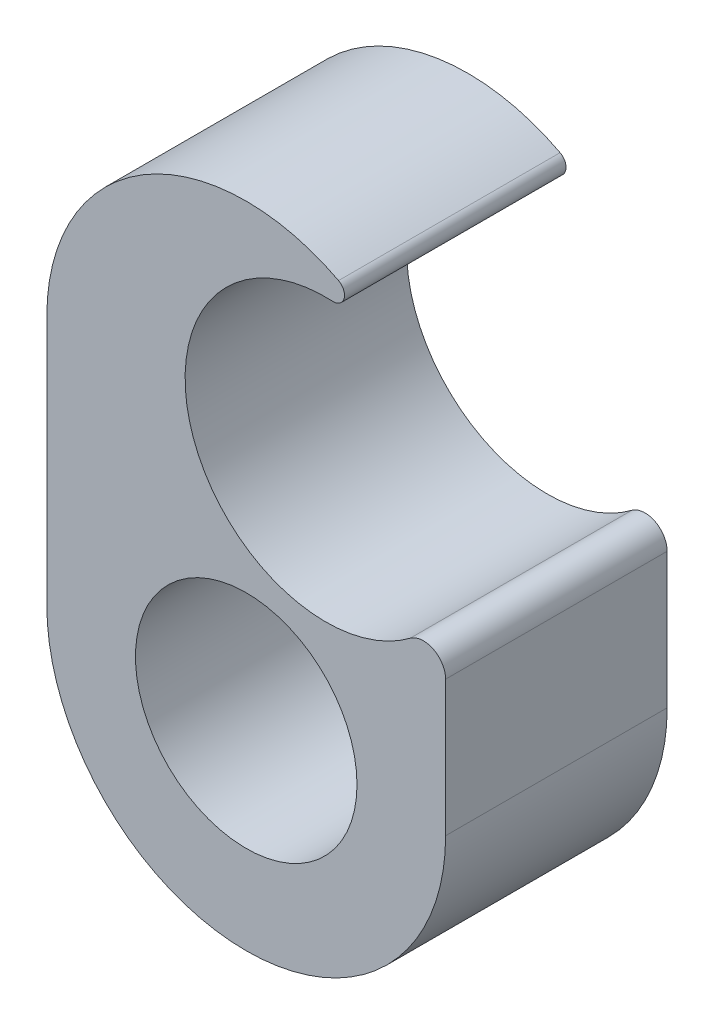
ISO-10303-21;
HEADER;
FILE_DESCRIPTION(('STEP AP214'),'2;1');
FILE_NAME('part.step','',(''),(''),'','','');
FILE_SCHEMA(('AUTOMOTIVE_DESIGN { 1 0 10303 214 1 1 1 1 }'));
ENDSEC;
DATA;
#1=APPLICATION_CONTEXT('core data for automotive mechanical design processes');
#2=APPLICATION_PROTOCOL_DEFINITION('international standard','automotive_design',2000,#1);
#3=PRODUCT_CONTEXT('',#1,'mechanical');
#4=PRODUCT('Part','Part','',(#3));
#5=PRODUCT_RELATED_PRODUCT_CATEGORY('part','',(#4));
#6=PRODUCT_DEFINITION_FORMATION('','',#4);
#7=PRODUCT_DEFINITION_CONTEXT('part definition',#1,'design');
#8=PRODUCT_DEFINITION('design','',#6,#7);
#9=PRODUCT_DEFINITION_SHAPE('','',#8);
#10=(LENGTH_UNIT() NAMED_UNIT(*) SI_UNIT(.MILLI.,.METRE.));
#11=(NAMED_UNIT(*) PLANE_ANGLE_UNIT() SI_UNIT($,.RADIAN.));
#12=(NAMED_UNIT(*) SI_UNIT($,.STERADIAN.) SOLID_ANGLE_UNIT());
#13=UNCERTAINTY_MEASURE_WITH_UNIT(LENGTH_MEASURE(1.E-05),#10,'distance_accuracy_value','');
#14=(GEOMETRIC_REPRESENTATION_CONTEXT(3) GLOBAL_UNCERTAINTY_ASSIGNED_CONTEXT((#13)) GLOBAL_UNIT_ASSIGNED_CONTEXT((#10,
#11,#12)) REPRESENTATION_CONTEXT('',''));
#15=CARTESIAN_POINT('',(0.,0.,0.));
#16=DIRECTION('',(0.,0.,1.));
#17=DIRECTION('',(1.,0.,0.));
#18=AXIS2_PLACEMENT_3D('',#15,#16,#17);
#19=CARTESIAN_POINT('',(9.,0.,10.));
#20=DIRECTION('',(0.,0.,-1.));
#21=DIRECTION('',(-1.,0.,0.));
#22=AXIS2_PLACEMENT_3D('',#19,#20,#21);
#23=PLANE('',#22);
#24=CARTESIAN_POINT('',(9.,0.,10.));
#25=DIRECTION('',(0.,0.,1.));
#26=DIRECTION('',(-1.,0.,0.));
#27=AXIS2_PLACEMENT_3D('',#24,#25,#26);
#28=CIRCLE('',#27,9.);
#29=CARTESIAN_POINT('',(0.,0.,10.));
#30=VERTEX_POINT('',#29);
#31=CARTESIAN_POINT('',(18.,0.,10.));
#32=VERTEX_POINT('',#31);
#33=EDGE_CURVE('E137',#30,#32,#28,.T.);
#34=ORIENTED_EDGE('',*,*,#33,.T.);
#35=DIRECTION('',(0.,1.,0.));
#36=VECTOR('',#35,1.);
#37=CARTESIAN_POINT('',(18.,0.,10.));
#38=LINE('',#37,#36);
#39=CARTESIAN_POINT('',(18.,6.11923791832924,10.));
#40=VERTEX_POINT('',#39);
#41=EDGE_CURVE('E90',#32,#40,#38,.T.);
#42=ORIENTED_EDGE('',*,*,#41,.T.);
#43=CARTESIAN_POINT('',(17.,6.11923791832924,10.));
#44=DIRECTION('',(0.,0.,1.));
#45=DIRECTION('',(1.,0.,0.));
#46=AXIS2_PLACEMENT_3D('',#43,#44,#45);
#47=CIRCLE('',#46,1.);
#48=CARTESIAN_POINT('',(16.4001382709992,6.91934160291029,10.));
#49=VERTEX_POINT('',#48);
#50=EDGE_CURVE('E149',#40,#49,#47,.T.);
#51=ORIENTED_EDGE('',*,*,#50,.T.);
#52=CARTESIAN_POINT('',(12.5910162918442,12.,10.));
#53=DIRECTION('',(0.,0.,-1.));
#54=DIRECTION('',(1.,0.,0.));
#55=AXIS2_PLACEMENT_3D('',#52,#53,#54);
#56=CIRCLE('',#55,6.35);
#57=CARTESIAN_POINT('',(12.910980025213,18.3419337121519,10.));
#58=VERTEX_POINT('',#57);
#59=EDGE_CURVE('E106',#49,#58,#56,.T.);
#60=ORIENTED_EDGE('',*,*,#59,.T.);
#61=CARTESIAN_POINT('',(12.9361740199664,18.8412985713765,10.));
#62=DIRECTION('',(0.,0.,1.));
#63=DIRECTION('',(-1.,0.,0.));
#64=AXIS2_PLACEMENT_3D('',#61,#62,#63);
#65=CIRCLE('',#64,0.499999999999999);
#66=CARTESIAN_POINT('',(13.1677136681998,19.2844569982353,10.));
#67=VERTEX_POINT('',#66);
#68=EDGE_CURVE('E100',#58,#67,#65,.T.);
#69=ORIENTED_EDGE('',*,*,#68,.T.);
#70=CARTESIAN_POINT('',(9.,11.3076053147764,10.));
#71=DIRECTION('',(0.,0.,1.));
#72=DIRECTION('',(-1.,0.,0.));
#73=AXIS2_PLACEMENT_3D('',#70,#71,#72);
#74=CIRCLE('',#73,9.);
#75=CARTESIAN_POINT('',(0.,11.3076053147764,10.));
#76=VERTEX_POINT('',#75);
#77=EDGE_CURVE('E104',#67,#76,#74,.T.);
#78=ORIENTED_EDGE('',*,*,#77,.T.);
#79=DIRECTION('',(0.,-1.,0.));
#80=VECTOR('',#79,1.);
#81=CARTESIAN_POINT('',(0.,0.,10.));
#82=LINE('',#81,#80);
#83=EDGE_CURVE('E50',#76,#30,#82,.T.);
#84=ORIENTED_EDGE('',*,*,#83,.T.);
#85=EDGE_LOOP('',(#34,#42,#51,#60,#69,#78,#84));
#86=FACE_BOUND('',#85,.T.);
#87=CARTESIAN_POINT('',(9.,0.,10.));
#88=DIRECTION('',(0.,0.,1.));
#89=DIRECTION('',(1.,0.,0.));
#90=AXIS2_PLACEMENT_3D('',#87,#88,#89);
#91=CIRCLE('',#90,5.);
#92=CARTESIAN_POINT('',(14.,0.,10.));
#93=VERTEX_POINT('',#92);
#94=EDGE_CURVE('E128',#93,#93,#91,.T.);
#95=ORIENTED_EDGE('',*,*,#94,.F.);
#96=EDGE_LOOP('',(#95));
#97=FACE_BOUND('',#96,.T.);
#98=ADVANCED_FACE('F33',(#86,#97),#23,.F.);
#99=CARTESIAN_POINT('',(9.,0.,0.));
#100=DIRECTION('',(0.,0.,-1.));
#101=DIRECTION('',(-1.,0.,0.));
#102=AXIS2_PLACEMENT_3D('',#99,#100,#101);
#103=PLANE('',#102);
#104=CARTESIAN_POINT('',(9.,0.,0.));
#105=DIRECTION('',(0.,0.,1.));
#106=DIRECTION('',(-1.,0.,0.));
#107=AXIS2_PLACEMENT_3D('',#104,#105,#106);
#108=CIRCLE('',#107,9.);
#109=CARTESIAN_POINT('',(0.,0.,0.));
#110=VERTEX_POINT('',#109);
#111=CARTESIAN_POINT('',(18.,0.,0.));
#112=VERTEX_POINT('',#111);
#113=EDGE_CURVE('E124',#110,#112,#108,.T.);
#114=ORIENTED_EDGE('',*,*,#113,.F.);
#115=DIRECTION('',(0.,-1.,0.));
#116=VECTOR('',#115,1.);
#117=CARTESIAN_POINT('',(0.,0.,0.));
#118=LINE('',#117,#116);
#119=CARTESIAN_POINT('',(0.,11.3076053147764,0.));
#120=VERTEX_POINT('',#119);
#121=EDGE_CURVE('E82',#120,#110,#118,.T.);
#122=ORIENTED_EDGE('',*,*,#121,.F.);
#123=CARTESIAN_POINT('',(9.,11.3076053147764,0.));
#124=DIRECTION('',(0.,0.,1.));
#125=DIRECTION('',(-1.,0.,0.));
#126=AXIS2_PLACEMENT_3D('',#123,#124,#125);
#127=CIRCLE('',#126,9.);
#128=CARTESIAN_POINT('',(13.1677136681998,19.2844569982353,0.));
#129=VERTEX_POINT('',#128);
#130=EDGE_CURVE('E76',#129,#120,#127,.T.);
#131=ORIENTED_EDGE('',*,*,#130,.F.);
#132=CARTESIAN_POINT('',(12.9361740199664,18.8412985713765,0.));
#133=DIRECTION('',(0.,0.,1.));
#134=DIRECTION('',(-1.,0.,0.));
#135=AXIS2_PLACEMENT_3D('',#132,#133,#134);
#136=CIRCLE('',#135,0.499999999999999);
#137=CARTESIAN_POINT('',(12.910980025213,18.3419337121519,0.));
#138=VERTEX_POINT('',#137);
#139=EDGE_CURVE('E114',#138,#129,#136,.T.);
#140=ORIENTED_EDGE('',*,*,#139,.F.);
#141=CARTESIAN_POINT('',(12.5910162918442,12.,0.));
#142=DIRECTION('',(0.,0.,-1.));
#143=DIRECTION('',(1.,0.,0.));
#144=AXIS2_PLACEMENT_3D('',#141,#142,#143);
#145=CIRCLE('',#144,6.35);
#146=CARTESIAN_POINT('',(16.4001382709992,6.91934160291029,0.));
#147=VERTEX_POINT('',#146);
#148=EDGE_CURVE('E132',#147,#138,#145,.T.);
#149=ORIENTED_EDGE('',*,*,#148,.F.);
#150=CARTESIAN_POINT('',(17.,6.11923791832924,0.));
#151=DIRECTION('',(0.,0.,1.));
#152=DIRECTION('',(1.,0.,0.));
#153=AXIS2_PLACEMENT_3D('',#150,#151,#152);
#154=CIRCLE('',#153,1.);
#155=CARTESIAN_POINT('',(18.,6.11923791832924,0.));
#156=VERTEX_POINT('',#155);
#157=EDGE_CURVE('E130',#156,#147,#154,.T.);
#158=ORIENTED_EDGE('',*,*,#157,.F.);
#159=DIRECTION('',(0.,1.,0.));
#160=VECTOR('',#159,1.);
#161=CARTESIAN_POINT('',(18.,0.,0.));
#162=LINE('',#161,#160);
#163=EDGE_CURVE('E127',#112,#156,#162,.T.);
#164=ORIENTED_EDGE('',*,*,#163,.F.);
#165=EDGE_LOOP('',(#114,#122,#131,#140,#149,#158,#164));
#166=FACE_BOUND('',#165,.T.);
#167=CARTESIAN_POINT('',(9.,0.,0.));
#168=DIRECTION('',(0.,0.,1.));
#169=DIRECTION('',(1.,0.,0.));
#170=AXIS2_PLACEMENT_3D('',#167,#168,#169);
#171=CIRCLE('',#170,5.);
#172=CARTESIAN_POINT('',(14.,0.,0.));
#173=VERTEX_POINT('',#172);
#174=EDGE_CURVE('E161',#173,#173,#171,.T.);
#175=ORIENTED_EDGE('',*,*,#174,.T.);
#176=EDGE_LOOP('',(#175));
#177=FACE_BOUND('',#176,.T.);
#178=ADVANCED_FACE('F153',(#166,#177),#103,.T.);
#179=CARTESIAN_POINT('',(9.,0.,10.));
#180=DIRECTION('',(0.,0.,-1.));
#181=DIRECTION('',(-1.,0.,0.));
#182=AXIS2_PLACEMENT_3D('',#179,#180,#181);
#183=CYLINDRICAL_SURFACE('',#182,9.);
#184=ORIENTED_EDGE('',*,*,#113,.T.);
#185=DIRECTION('',(0.,0.,-1.));
#186=VECTOR('',#185,1.);
#187=CARTESIAN_POINT('',(18.,0.,10.));
#188=LINE('',#187,#186);
#189=EDGE_CURVE('E11',#32,#112,#188,.T.);
#190=ORIENTED_EDGE('',*,*,#189,.F.);
#191=ORIENTED_EDGE('',*,*,#33,.F.);
#192=DIRECTION('',(0.,0.,-1.));
#193=VECTOR('',#192,1.);
#194=CARTESIAN_POINT('',(0.,0.,10.));
#195=LINE('',#194,#193);
#196=EDGE_CURVE('E120',#30,#110,#195,.T.);
#197=ORIENTED_EDGE('',*,*,#196,.T.);
#198=EDGE_LOOP('',(#184,#190,#191,#197));
#199=FACE_BOUND('',#198,.T.);
#200=ADVANCED_FACE('F35',(#199),#183,.T.);
#201=CARTESIAN_POINT('',(18.,0.,10.));
#202=DIRECTION('',(-1.,0.,0.));
#203=DIRECTION('',(0.,0.,1.));
#204=AXIS2_PLACEMENT_3D('',#201,#202,#203);
#205=PLANE('',#204);
#206=ORIENTED_EDGE('',*,*,#163,.T.);
#207=DIRECTION('',(0.,0.,-1.));
#208=VECTOR('',#207,1.);
#209=CARTESIAN_POINT('',(18.,6.11923791832924,10.));
#210=LINE('',#209,#208);
#211=EDGE_CURVE('E42',#40,#156,#210,.T.);
#212=ORIENTED_EDGE('',*,*,#211,.F.);
#213=ORIENTED_EDGE('',*,*,#41,.F.);
#214=ORIENTED_EDGE('',*,*,#189,.T.);
#215=EDGE_LOOP('',(#206,#212,#213,#214));
#216=FACE_BOUND('',#215,.T.);
#217=ADVANCED_FACE('F187',(#216),#205,.F.);
#218=CARTESIAN_POINT('',(17.,6.11923791832924,10.));
#219=DIRECTION('',(0.,0.,-1.));
#220=DIRECTION('',(-1.,0.,0.));
#221=AXIS2_PLACEMENT_3D('',#218,#219,#220);
#222=CYLINDRICAL_SURFACE('',#221,1.);
#223=ORIENTED_EDGE('',*,*,#157,.T.);
#224=DIRECTION('',(0.,0.,-1.));
#225=VECTOR('',#224,1.);
#226=CARTESIAN_POINT('',(16.4001382709992,6.91934160291029,10.));
#227=LINE('',#226,#225);
#228=EDGE_CURVE('E141',#49,#147,#227,.T.);
#229=ORIENTED_EDGE('',*,*,#228,.F.);
#230=ORIENTED_EDGE('',*,*,#50,.F.);
#231=ORIENTED_EDGE('',*,*,#211,.T.);
#232=EDGE_LOOP('',(#223,#229,#230,#231));
#233=FACE_BOUND('',#232,.T.);
#234=ADVANCED_FACE('F147',(#233),#222,.T.);
#235=CARTESIAN_POINT('',(12.5910162918442,12.,10.));
#236=DIRECTION('',(0.,0.,-1.));
#237=DIRECTION('',(-1.,0.,0.));
#238=AXIS2_PLACEMENT_3D('',#235,#236,#237);
#239=CYLINDRICAL_SURFACE('',#238,6.35);
#240=ORIENTED_EDGE('',*,*,#148,.T.);
#241=DIRECTION('',(0.,0.,-1.));
#242=VECTOR('',#241,1.);
#243=CARTESIAN_POINT('',(12.910980025213,18.3419337121519,10.));
#244=LINE('',#243,#242);
#245=EDGE_CURVE('E115',#58,#138,#244,.T.);
#246=ORIENTED_EDGE('',*,*,#245,.F.);
#247=ORIENTED_EDGE('',*,*,#59,.F.);
#248=ORIENTED_EDGE('',*,*,#228,.T.);
#249=EDGE_LOOP('',(#240,#246,#247,#248));
#250=FACE_BOUND('',#249,.T.);
#251=ADVANCED_FACE('F156',(#250),#239,.F.);
#252=CARTESIAN_POINT('',(12.9361740199664,18.8412985713765,10.));
#253=DIRECTION('',(0.,0.,-1.));
#254=DIRECTION('',(-1.,0.,0.));
#255=AXIS2_PLACEMENT_3D('',#252,#253,#254);
#256=CYLINDRICAL_SURFACE('',#255,0.499999999999999);
#257=ORIENTED_EDGE('',*,*,#139,.T.);
#258=DIRECTION('',(0.,0.,-1.));
#259=VECTOR('',#258,1.);
#260=CARTESIAN_POINT('',(13.1677136681998,19.2844569982353,10.));
#261=LINE('',#260,#259);
#262=EDGE_CURVE('E111',#67,#129,#261,.T.);
#263=ORIENTED_EDGE('',*,*,#262,.F.);
#264=ORIENTED_EDGE('',*,*,#68,.F.);
#265=ORIENTED_EDGE('',*,*,#245,.T.);
#266=EDGE_LOOP('',(#257,#263,#264,#265));
#267=FACE_BOUND('',#266,.T.);
#268=ADVANCED_FACE('F112',(#267),#256,.T.);
#269=CARTESIAN_POINT('',(9.,11.3076053147764,10.));
#270=DIRECTION('',(0.,0.,-1.));
#271=DIRECTION('',(-1.,0.,0.));
#272=AXIS2_PLACEMENT_3D('',#269,#270,#271);
#273=CYLINDRICAL_SURFACE('',#272,9.);
#274=ORIENTED_EDGE('',*,*,#130,.T.);
#275=DIRECTION('',(0.,0.,-1.));
#276=VECTOR('',#275,1.);
#277=CARTESIAN_POINT('',(0.,11.3076053147764,10.));
#278=LINE('',#277,#276);
#279=EDGE_CURVE('E116',#76,#120,#278,.T.);
#280=ORIENTED_EDGE('',*,*,#279,.F.);
#281=ORIENTED_EDGE('',*,*,#77,.F.);
#282=ORIENTED_EDGE('',*,*,#262,.T.);
#283=EDGE_LOOP('',(#274,#280,#281,#282));
#284=FACE_BOUND('',#283,.T.);
#285=ADVANCED_FACE('F118',(#284),#273,.T.);
#286=CARTESIAN_POINT('',(0.,0.,10.));
#287=DIRECTION('',(1.,0.,0.));
#288=DIRECTION('',(0.,0.,-1.));
#289=AXIS2_PLACEMENT_3D('',#286,#287,#288);
#290=PLANE('',#289);
#291=ORIENTED_EDGE('',*,*,#121,.T.);
#292=ORIENTED_EDGE('',*,*,#196,.F.);
#293=ORIENTED_EDGE('',*,*,#83,.F.);
#294=ORIENTED_EDGE('',*,*,#279,.T.);
#295=EDGE_LOOP('',(#291,#292,#293,#294));
#296=FACE_BOUND('',#295,.T.);
#297=ADVANCED_FACE('F177',(#296),#290,.F.);
#298=CARTESIAN_POINT('',(9.,0.,10.));
#299=DIRECTION('',(0.,0.,-1.));
#300=DIRECTION('',(-1.,0.,0.));
#301=AXIS2_PLACEMENT_3D('',#298,#299,#300);
#302=CYLINDRICAL_SURFACE('',#301,5.);
#303=ORIENTED_EDGE('',*,*,#94,.T.);
#304=EDGE_LOOP('',(#303));
#305=FACE_BOUND('',#304,.T.);
#306=ORIENTED_EDGE('',*,*,#174,.F.);
#307=EDGE_LOOP('',(#306));
#308=FACE_BOUND('',#307,.T.);
#309=ADVANCED_FACE('F167',(#305,#308),#302,.F.);
#310=CLOSED_SHELL('',(#98,#178,#200,#217,#234,#251,#268,#285,#297,#309));
#311=MANIFOLD_SOLID_BREP('B2',#310);
#312=ADVANCED_BREP_SHAPE_REPRESENTATION('',(#18,#311),#14);
#313=SHAPE_DEFINITION_REPRESENTATION(#9,#312);
ENDSEC;
END-ISO-10303-21;
